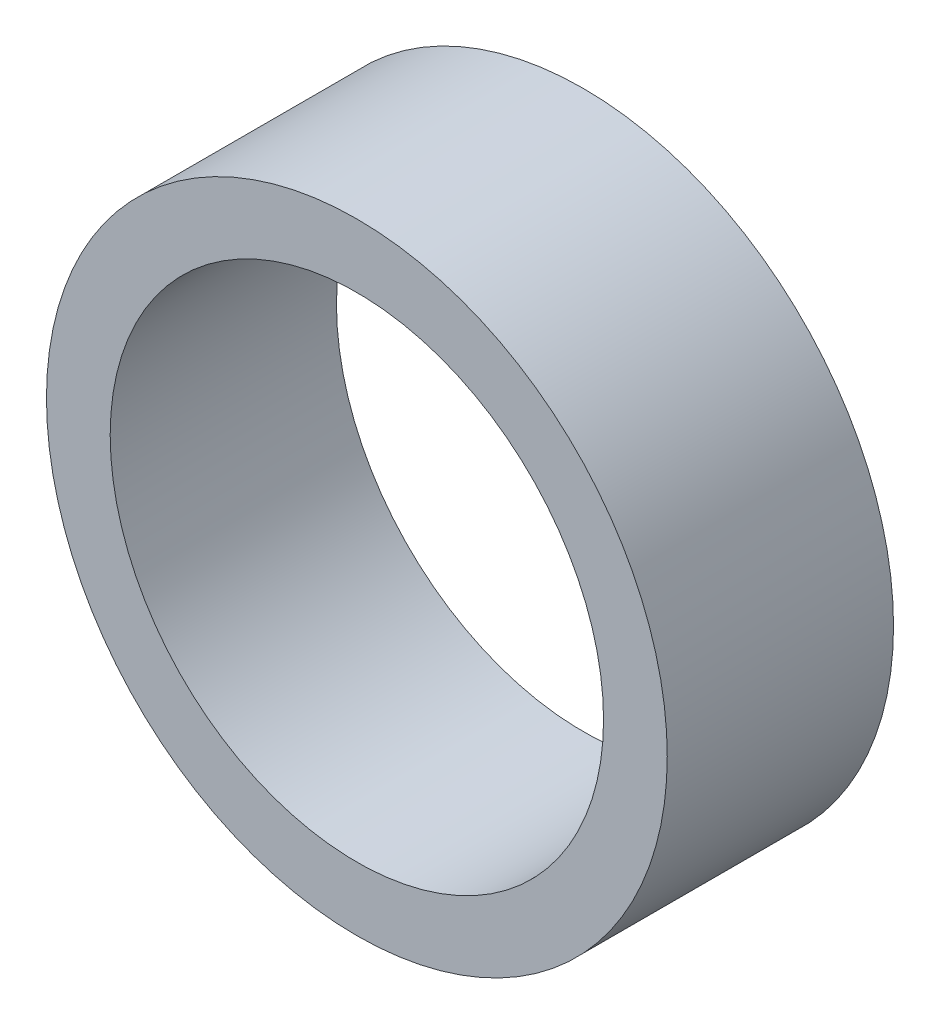
ISO-10303-21;
HEADER;
FILE_DESCRIPTION(('STEP AP214'),'2;1');
FILE_NAME('part.step','',(''),(''),'','','');
FILE_SCHEMA(('AUTOMOTIVE_DESIGN { 1 0 10303 214 1 1 1 1 }'));
ENDSEC;
DATA;
#1=APPLICATION_CONTEXT('core data for automotive mechanical design processes');
#2=APPLICATION_PROTOCOL_DEFINITION('international standard','automotive_design',2000,#1);
#3=PRODUCT_CONTEXT('',#1,'mechanical');
#4=PRODUCT('Part','Part','',(#3));
#5=PRODUCT_RELATED_PRODUCT_CATEGORY('part','',(#4));
#6=PRODUCT_DEFINITION_FORMATION('','',#4);
#7=PRODUCT_DEFINITION_CONTEXT('part definition',#1,'design');
#8=PRODUCT_DEFINITION('design','',#6,#7);
#9=PRODUCT_DEFINITION_SHAPE('','',#8);
#10=(LENGTH_UNIT() NAMED_UNIT(*) SI_UNIT(.MILLI.,.METRE.));
#11=(NAMED_UNIT(*) PLANE_ANGLE_UNIT() SI_UNIT($,.RADIAN.));
#12=(NAMED_UNIT(*) SI_UNIT($,.STERADIAN.) SOLID_ANGLE_UNIT());
#13=UNCERTAINTY_MEASURE_WITH_UNIT(LENGTH_MEASURE(1.E-05),#10,'distance_accuracy_value','');
#14=(GEOMETRIC_REPRESENTATION_CONTEXT(3) GLOBAL_UNCERTAINTY_ASSIGNED_CONTEXT((#13)) GLOBAL_UNIT_ASSIGNED_CONTEXT((#10,
#11,#12)) REPRESENTATION_CONTEXT('',''));
#15=CARTESIAN_POINT('',(0.,0.,0.));
#16=DIRECTION('',(0.,0.,1.));
#17=DIRECTION('',(1.,0.,0.));
#18=AXIS2_PLACEMENT_3D('',#15,#16,#17);
#19=CARTESIAN_POINT('',(0.,0.,6.925));
#20=DIRECTION('',(0.,0.,1.));
#21=DIRECTION('',(1.,0.,0.));
#22=AXIS2_PLACEMENT_3D('',#19,#20,#21);
#23=PLANE('',#22);
#24=CARTESIAN_POINT('',(0.,0.,6.925));
#25=DIRECTION('',(0.,0.,1.));
#26=DIRECTION('',(1.,0.,0.));
#27=AXIS2_PLACEMENT_3D('',#24,#25,#26);
#28=CIRCLE('',#27,19.);
#29=CARTESIAN_POINT('',(19.,0.,6.925));
#30=VERTEX_POINT('',#29);
#31=EDGE_CURVE('E11',#30,#30,#28,.T.);
#32=ORIENTED_EDGE('',*,*,#31,.T.);
#33=EDGE_LOOP('',(#32));
#34=FACE_BOUND('',#33,.T.);
#35=CARTESIAN_POINT('',(0.,0.,6.925));
#36=DIRECTION('',(0.,0.,1.));
#37=DIRECTION('',(1.,0.,0.));
#38=AXIS2_PLACEMENT_3D('',#35,#36,#37);
#39=CIRCLE('',#38,15.1);
#40=CARTESIAN_POINT('',(15.1,0.,6.925));
#41=VERTEX_POINT('',#40);
#42=EDGE_CURVE('E53',#41,#41,#39,.T.);
#43=ORIENTED_EDGE('',*,*,#42,.F.);
#44=EDGE_LOOP('',(#43));
#45=FACE_BOUND('',#44,.T.);
#46=ADVANCED_FACE('F43',(#34,#45),#23,.T.);
#47=CARTESIAN_POINT('',(0.,0.,-6.925));
#48=DIRECTION('',(0.,0.,1.));
#49=DIRECTION('',(1.,0.,0.));
#50=AXIS2_PLACEMENT_3D('',#47,#48,#49);
#51=PLANE('',#50);
#52=CARTESIAN_POINT('',(0.,0.,-6.925));
#53=DIRECTION('',(0.,0.,1.));
#54=DIRECTION('',(1.,0.,0.));
#55=AXIS2_PLACEMENT_3D('',#52,#53,#54);
#56=CIRCLE('',#55,19.);
#57=CARTESIAN_POINT('',(19.,0.,-6.925));
#58=VERTEX_POINT('',#57);
#59=EDGE_CURVE('E50',#58,#58,#56,.T.);
#60=ORIENTED_EDGE('',*,*,#59,.F.);
#61=EDGE_LOOP('',(#60));
#62=FACE_BOUND('',#61,.T.);
#63=CARTESIAN_POINT('',(0.,0.,-6.925));
#64=DIRECTION('',(0.,0.,1.));
#65=DIRECTION('',(1.,0.,0.));
#66=AXIS2_PLACEMENT_3D('',#63,#64,#65);
#67=CIRCLE('',#66,15.1);
#68=CARTESIAN_POINT('',(15.1,0.,-6.925));
#69=VERTEX_POINT('',#68);
#70=EDGE_CURVE('E57',#69,#69,#67,.T.);
#71=ORIENTED_EDGE('',*,*,#70,.T.);
#72=EDGE_LOOP('',(#71));
#73=FACE_BOUND('',#72,.T.);
#74=ADVANCED_FACE('F67',(#62,#73),#51,.F.);
#75=CARTESIAN_POINT('',(0.,0.,6.925));
#76=DIRECTION('',(0.,0.,-1.));
#77=DIRECTION('',(-1.,0.,0.));
#78=AXIS2_PLACEMENT_3D('',#75,#76,#77);
#79=CYLINDRICAL_SURFACE('',#78,19.);
#80=ORIENTED_EDGE('',*,*,#31,.F.);
#81=EDGE_LOOP('',(#80));
#82=FACE_BOUND('',#81,.T.);
#83=ORIENTED_EDGE('',*,*,#59,.T.);
#84=EDGE_LOOP('',(#83));
#85=FACE_BOUND('',#84,.T.);
#86=ADVANCED_FACE('F44',(#82,#85),#79,.T.);
#87=CARTESIAN_POINT('',(0.,0.,6.925));
#88=DIRECTION('',(0.,0.,-1.));
#89=DIRECTION('',(-1.,0.,0.));
#90=AXIS2_PLACEMENT_3D('',#87,#88,#89);
#91=CYLINDRICAL_SURFACE('',#90,15.1);
#92=ORIENTED_EDGE('',*,*,#42,.T.);
#93=EDGE_LOOP('',(#92));
#94=FACE_BOUND('',#93,.T.);
#95=ORIENTED_EDGE('',*,*,#70,.F.);
#96=EDGE_LOOP('',(#95));
#97=FACE_BOUND('',#96,.T.);
#98=ADVANCED_FACE('F62',(#94,#97),#91,.F.);
#99=CLOSED_SHELL('',(#46,#74,#86,#98));
#100=MANIFOLD_SOLID_BREP('B2',#99);
#101=ADVANCED_BREP_SHAPE_REPRESENTATION('',(#18,#100),#14);
#102=SHAPE_DEFINITION_REPRESENTATION(#9,#101);
ENDSEC;
END-ISO-10303-21;
